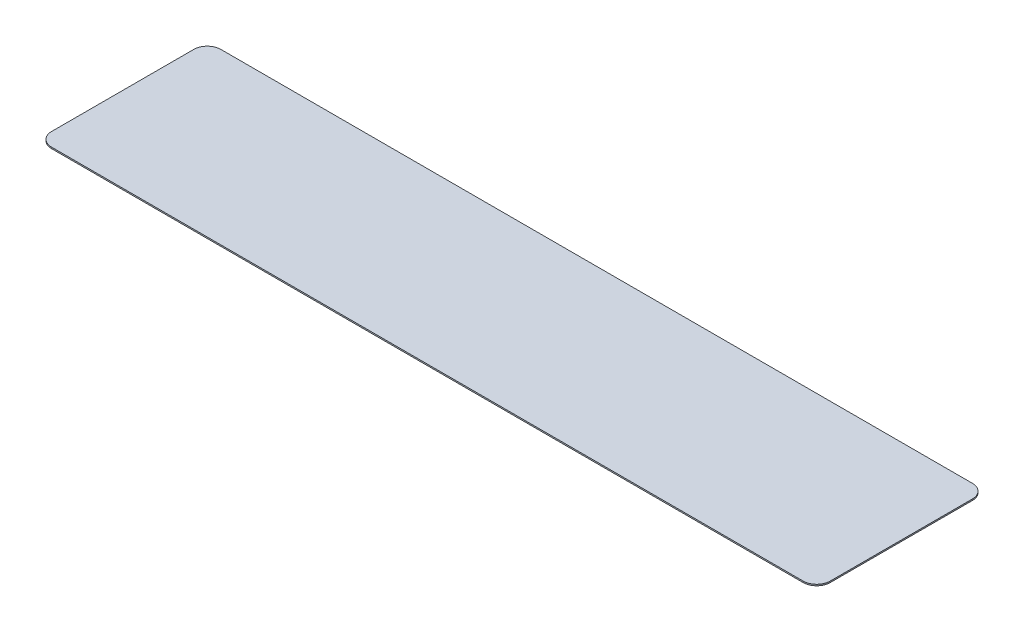
ISO-10303-21;
HEADER;
FILE_DESCRIPTION(('STEP AP214'),'2;1');
FILE_NAME('part.step','',(''),(''),'','','');
FILE_SCHEMA(('AUTOMOTIVE_DESIGN { 1 0 10303 214 1 1 1 1 }'));
ENDSEC;
DATA;
#1=APPLICATION_CONTEXT('core data for automotive mechanical design processes');
#2=APPLICATION_PROTOCOL_DEFINITION('international standard','automotive_design',2000,#1);
#3=PRODUCT_CONTEXT('',#1,'mechanical');
#4=PRODUCT('Part','Part','',(#3));
#5=PRODUCT_RELATED_PRODUCT_CATEGORY('part','',(#4));
#6=PRODUCT_DEFINITION_FORMATION('','',#4);
#7=PRODUCT_DEFINITION_CONTEXT('part definition',#1,'design');
#8=PRODUCT_DEFINITION('design','',#6,#7);
#9=PRODUCT_DEFINITION_SHAPE('','',#8);
#10=(LENGTH_UNIT() NAMED_UNIT(*) SI_UNIT(.MILLI.,.METRE.));
#11=(NAMED_UNIT(*) PLANE_ANGLE_UNIT() SI_UNIT($,.RADIAN.));
#12=(NAMED_UNIT(*) SI_UNIT($,.STERADIAN.) SOLID_ANGLE_UNIT());
#13=UNCERTAINTY_MEASURE_WITH_UNIT(LENGTH_MEASURE(1.E-05),#10,'distance_accuracy_value','');
#14=(GEOMETRIC_REPRESENTATION_CONTEXT(3) GLOBAL_UNCERTAINTY_ASSIGNED_CONTEXT((#13)) GLOBAL_UNIT_ASSIGNED_CONTEXT((#10,
#11,#12)) REPRESENTATION_CONTEXT('',''));
#15=CARTESIAN_POINT('',(0.,0.,0.));
#16=DIRECTION('',(0.,0.,1.));
#17=DIRECTION('',(1.,0.,0.));
#18=AXIS2_PLACEMENT_3D('',#15,#16,#17);
#19=CARTESIAN_POINT('',(-147.500000000002,0.399999999999713,-0.675675675675946));
#20=DIRECTION('',(0.,-0.999999999999995,0.));
#21=DIRECTION('',(0.,0.,-1.));
#22=AXIS2_PLACEMENT_3D('',#19,#20,#21);
#23=CYLINDRICAL_SURFACE('',#22,4.);
#24=CARTESIAN_POINT('',(-147.500000000001,-6.73072708679001E-13,-0.675675675675835));
#25=DIRECTION('',(0.,-0.999999999999995,0.));
#26=DIRECTION('',(0.,0.,-1.));
#27=AXIS2_PLACEMENT_3D('',#24,#25,#26);
#28=CIRCLE('',#27,4.);
#29=CARTESIAN_POINT('',(-147.5,-3.7470027081099E-13,3.3243243243245));
#30=VERTEX_POINT('',#29);
#31=CARTESIAN_POINT('',(-151.500000000003,-7.07767178198537E-13,-0.675675675675502));
#32=VERTEX_POINT('',#31);
#33=EDGE_CURVE('E143',#30,#32,#28,.T.);
#34=ORIENTED_EDGE('',*,*,#33,.F.);
#35=DIRECTION('',(0.,-0.999999999999995,0.));
#36=VECTOR('',#35,1.);
#37=CARTESIAN_POINT('',(-147.500000000002,0.399999999999665,3.32432432432422));
#38=LINE('',#37,#36);
#39=CARTESIAN_POINT('',(-147.500000000002,0.399999999999665,3.32432432432422));
#40=VERTEX_POINT('',#39);
#41=EDGE_CURVE('E11',#40,#30,#38,.T.);
#42=ORIENTED_EDGE('',*,*,#41,.F.);
#43=CARTESIAN_POINT('',(-147.500000000002,0.399999999999713,-0.675675675675946));
#44=DIRECTION('',(0.,-0.999999999999995,0.));
#45=DIRECTION('',(0.,0.,-1.));
#46=AXIS2_PLACEMENT_3D('',#43,#44,#45);
#47=CIRCLE('',#46,4.);
#48=CARTESIAN_POINT('',(-151.500000000001,0.399999999999928,-0.675675675676668));
#49=VERTEX_POINT('',#48);
#50=EDGE_CURVE('E169',#40,#49,#47,.T.);
#51=ORIENTED_EDGE('',*,*,#50,.T.);
#52=DIRECTION('',(0.,-0.999999999999995,0.));
#53=VECTOR('',#52,1.);
#54=CARTESIAN_POINT('',(-151.500000000001,0.399999999999928,-0.675675675676668));
#55=LINE('',#54,#53);
#56=EDGE_CURVE('E41',#49,#32,#55,.T.);
#57=ORIENTED_EDGE('',*,*,#56,.T.);
#58=EDGE_LOOP('',(#34,#42,#51,#57));
#59=FACE_BOUND('',#58,.T.);
#60=ADVANCED_FACE('F38',(#59),#23,.T.);
#61=CARTESIAN_POINT('',(-147.500000000002,0.399999999999665,3.32432432432422));
#62=DIRECTION('',(0.,0.,-1.));
#63=DIRECTION('',(-0.999999999999998,0.,0.));
#64=AXIS2_PLACEMENT_3D('',#61,#62,#63);
#65=PLANE('',#64);
#66=DIRECTION('',(0.999999999999998,0.,0.));
#67=VECTOR('',#66,1.);
#68=CARTESIAN_POINT('',(-147.5,-3.7470027081099E-13,3.3243243243245));
#69=LINE('',#68,#67);
#70=CARTESIAN_POINT('',(74.4999999999975,-2.77555756156289E-13,3.32432432432406));
#71=VERTEX_POINT('',#70);
#72=EDGE_CURVE('E84',#30,#71,#69,.T.);
#73=ORIENTED_EDGE('',*,*,#72,.T.);
#74=DIRECTION('',(0.,-0.999999999999995,0.));
#75=VECTOR('',#74,1.);
#76=CARTESIAN_POINT('',(74.4999999999974,0.399999999999706,3.324324324324));
#77=LINE('',#76,#75);
#78=CARTESIAN_POINT('',(74.4999999999974,0.399999999999706,3.324324324324));
#79=VERTEX_POINT('',#78);
#80=EDGE_CURVE('E48',#79,#71,#77,.T.);
#81=ORIENTED_EDGE('',*,*,#80,.F.);
#82=DIRECTION('',(0.999999999999998,0.,0.));
#83=VECTOR('',#82,1.);
#84=CARTESIAN_POINT('',(-147.500000000002,0.399999999999665,3.32432432432422));
#85=LINE('',#84,#83);
#86=EDGE_CURVE('E115',#40,#79,#85,.T.);
#87=ORIENTED_EDGE('',*,*,#86,.F.);
#88=ORIENTED_EDGE('',*,*,#41,.T.);
#89=EDGE_LOOP('',(#73,#81,#87,#88));
#90=FACE_BOUND('',#89,.T.);
#91=ADVANCED_FACE('F233',(#90),#65,.F.);
#92=CARTESIAN_POINT('',(74.4999999999994,0.399999999999762,-0.675675675675669));
#93=DIRECTION('',(0.,-0.999999999999995,0.));
#94=DIRECTION('',(0.,0.,-1.));
#95=AXIS2_PLACEMENT_3D('',#92,#93,#94);
#96=CYLINDRICAL_SURFACE('',#95,4.);
#97=CARTESIAN_POINT('',(74.5000000000003,-9.15933995315754E-13,-0.675675675675558));
#98=DIRECTION('',(0.,0.999999999999995,0.));
#99=DIRECTION('',(0.,0.,1.));
#100=AXIS2_PLACEMENT_3D('',#97,#98,#99);
#101=CIRCLE('',#100,4.);
#102=CARTESIAN_POINT('',(78.4999999999988,-6.52256026967279E-13,-0.675675675676446));
#103=VERTEX_POINT('',#102);
#104=EDGE_CURVE('E123',#71,#103,#101,.T.);
#105=ORIENTED_EDGE('',*,*,#104,.T.);
#106=DIRECTION('',(0.,-0.999999999999995,0.));
#107=VECTOR('',#106,1.);
#108=CARTESIAN_POINT('',(78.5000000000009,0.39999999999997,-0.675675675676501));
#109=LINE('',#108,#107);
#110=CARTESIAN_POINT('',(78.5000000000009,0.39999999999997,-0.675675675676501));
#111=VERTEX_POINT('',#110);
#112=EDGE_CURVE('E120',#111,#103,#109,.T.);
#113=ORIENTED_EDGE('',*,*,#112,.F.);
#114=CARTESIAN_POINT('',(74.4999999999994,0.399999999999762,-0.675675675675669));
#115=DIRECTION('',(0.,0.999999999999995,0.));
#116=DIRECTION('',(0.,0.,1.));
#117=AXIS2_PLACEMENT_3D('',#114,#115,#116);
#118=CIRCLE('',#117,4.);
#119=EDGE_CURVE('E108',#79,#111,#118,.T.);
#120=ORIENTED_EDGE('',*,*,#119,.F.);
#121=ORIENTED_EDGE('',*,*,#80,.T.);
#122=EDGE_LOOP('',(#105,#113,#120,#121));
#123=FACE_BOUND('',#122,.T.);
#124=ADVANCED_FACE('F121',(#123),#96,.T.);
#125=CARTESIAN_POINT('',(78.5000000000009,0.39999999999997,-0.675675675676501));
#126=DIRECTION('',(-0.999999999999998,0.,0.));
#127=DIRECTION('',(0.,0.,1.));
#128=AXIS2_PLACEMENT_3D('',#125,#126,#127);
#129=PLANE('',#128);
#130=DIRECTION('',(0.,0.,-1.));
#131=VECTOR('',#130,1.);
#132=CARTESIAN_POINT('',(78.4999999999988,-6.52256026967279E-13,-0.675675675676446));
#133=LINE('',#132,#131);
#134=CARTESIAN_POINT('',(78.4999999999988,0.,-42.6756756756765));
#135=VERTEX_POINT('',#134);
#136=EDGE_CURVE('E163',#103,#135,#133,.T.);
#137=ORIENTED_EDGE('',*,*,#136,.T.);
#138=DIRECTION('',(0.,-0.999999999999995,0.));
#139=VECTOR('',#138,1.);
#140=CARTESIAN_POINT('',(78.4999999999998,0.399999999999234,-42.6756756756764));
#141=LINE('',#140,#139);
#142=CARTESIAN_POINT('',(78.4999999999998,0.399999999999234,-42.6756756756764));
#143=VERTEX_POINT('',#142);
#144=EDGE_CURVE('E127',#143,#135,#141,.T.);
#145=ORIENTED_EDGE('',*,*,#144,.F.);
#146=DIRECTION('',(0.,0.,-1.));
#147=VECTOR('',#146,1.);
#148=CARTESIAN_POINT('',(78.5000000000009,0.39999999999997,-0.675675675676501));
#149=LINE('',#148,#147);
#150=EDGE_CURVE('E113',#111,#143,#149,.T.);
#151=ORIENTED_EDGE('',*,*,#150,.F.);
#152=ORIENTED_EDGE('',*,*,#112,.T.);
#153=EDGE_LOOP('',(#137,#145,#151,#152));
#154=FACE_BOUND('',#153,.T.);
#155=ADVANCED_FACE('F129',(#154),#129,.F.);
#156=CARTESIAN_POINT('',(74.5000000000011,0.399999999999207,-42.6756756756757));
#157=DIRECTION('',(0.,-0.999999999999995,0.));
#158=DIRECTION('',(0.,0.,-1.));
#159=AXIS2_PLACEMENT_3D('',#156,#157,#158);
#160=CYLINDRICAL_SURFACE('',#159,4.);
#161=CARTESIAN_POINT('',(74.4999999999978,0.,-42.6756756756741));
#162=DIRECTION('',(0.,0.999999999999995,0.));
#163=DIRECTION('',(0.,0.,1.));
#164=AXIS2_PLACEMENT_3D('',#161,#162,#163);
#165=CIRCLE('',#164,4.);
#166=CARTESIAN_POINT('',(74.4999999999991,-2.08166817117217E-13,-46.675675675676));
#167=VERTEX_POINT('',#166);
#168=EDGE_CURVE('E159',#135,#167,#165,.T.);
#169=ORIENTED_EDGE('',*,*,#168,.T.);
#170=DIRECTION('',(0.,-0.999999999999995,0.));
#171=VECTOR('',#170,1.);
#172=CARTESIAN_POINT('',(74.4999999999996,0.400000000000109,-46.6756756756748));
#173=LINE('',#172,#171);
#174=CARTESIAN_POINT('',(74.4999999999996,0.400000000000109,-46.6756756756748));
#175=VERTEX_POINT('',#174);
#176=EDGE_CURVE('E175',#175,#167,#173,.T.);
#177=ORIENTED_EDGE('',*,*,#176,.F.);
#178=CARTESIAN_POINT('',(74.5000000000011,0.399999999999207,-42.6756756756757));
#179=DIRECTION('',(0.,0.999999999999995,0.));
#180=DIRECTION('',(0.,0.,1.));
#181=AXIS2_PLACEMENT_3D('',#178,#179,#180);
#182=CIRCLE('',#181,4.);
#183=EDGE_CURVE('E133',#143,#175,#182,.T.);
#184=ORIENTED_EDGE('',*,*,#183,.F.);
#185=ORIENTED_EDGE('',*,*,#144,.T.);
#186=EDGE_LOOP('',(#169,#177,#184,#185));
#187=FACE_BOUND('',#186,.T.);
#188=ADVANCED_FACE('F191',(#187),#160,.T.);
#189=CARTESIAN_POINT('',(-147.500000000001,0.400000000000178,-46.6756756756764));
#190=DIRECTION('',(0.,0.,-1.));
#191=DIRECTION('',(-0.999999999999998,0.,0.));
#192=AXIS2_PLACEMENT_3D('',#189,#190,#191);
#193=PLANE('',#192);
#194=DIRECTION('',(0.999999999999998,0.,0.));
#195=VECTOR('',#194,1.);
#196=CARTESIAN_POINT('',(-147.499999999999,0.,-46.6756756756748));
#197=LINE('',#196,#195);
#198=CARTESIAN_POINT('',(-147.499999999999,0.,-46.6756756756748));
#199=VERTEX_POINT('',#198);
#200=EDGE_CURVE('E155',#199,#167,#197,.T.);
#201=ORIENTED_EDGE('',*,*,#200,.F.);
#202=DIRECTION('',(0.,-0.999999999999995,0.));
#203=VECTOR('',#202,1.);
#204=CARTESIAN_POINT('',(-147.500000000001,0.400000000000178,-46.6756756756764));
#205=LINE('',#204,#203);
#206=CARTESIAN_POINT('',(-147.500000000001,0.400000000000178,-46.6756756756764));
#207=VERTEX_POINT('',#206);
#208=EDGE_CURVE('E178',#207,#199,#205,.T.);
#209=ORIENTED_EDGE('',*,*,#208,.F.);
#210=DIRECTION('',(0.999999999999998,0.,0.));
#211=VECTOR('',#210,1.);
#212=CARTESIAN_POINT('',(-147.500000000001,0.400000000000178,-46.6756756756764));
#213=LINE('',#212,#211);
#214=EDGE_CURVE('E137',#207,#175,#213,.T.);
#215=ORIENTED_EDGE('',*,*,#214,.T.);
#216=ORIENTED_EDGE('',*,*,#176,.T.);
#217=EDGE_LOOP('',(#201,#209,#215,#216));
#218=FACE_BOUND('',#217,.T.);
#219=ADVANCED_FACE('F223',(#218),#193,.T.);
#220=CARTESIAN_POINT('',(-147.500000000001,0.399999999999311,-42.6756756756767));
#221=DIRECTION('',(0.,-0.999999999999995,0.));
#222=DIRECTION('',(0.,0.,-1.));
#223=AXIS2_PLACEMENT_3D('',#220,#221,#222);
#224=CYLINDRICAL_SURFACE('',#223,4.00000000000001);
#225=CARTESIAN_POINT('',(-147.500000000001,0.,-42.6756756756757));
#226=DIRECTION('',(0.,-0.999999999999995,0.));
#227=DIRECTION('',(0.,0.,-1.));
#228=AXIS2_PLACEMENT_3D('',#225,#226,#227);
#229=CIRCLE('',#228,4.00000000000001);
#230=CARTESIAN_POINT('',(-151.500000000002,0.,-42.6756756756766));
#231=VERTEX_POINT('',#230);
#232=EDGE_CURVE('E151',#231,#199,#229,.T.);
#233=ORIENTED_EDGE('',*,*,#232,.F.);
#234=DIRECTION('',(0.,-0.999999999999995,0.));
#235=VECTOR('',#234,1.);
#236=CARTESIAN_POINT('',(-151.500000000002,0.399999999999345,-42.6756756756771));
#237=LINE('',#236,#235);
#238=CARTESIAN_POINT('',(-151.500000000002,0.399999999999345,-42.6756756756771));
#239=VERTEX_POINT('',#238);
#240=EDGE_CURVE('E180',#239,#231,#237,.T.);
#241=ORIENTED_EDGE('',*,*,#240,.F.);
#242=CARTESIAN_POINT('',(-147.500000000001,0.399999999999311,-42.6756756756767));
#243=DIRECTION('',(0.,-0.999999999999995,0.));
#244=DIRECTION('',(0.,0.,-1.));
#245=AXIS2_PLACEMENT_3D('',#242,#243,#244);
#246=CIRCLE('',#245,4.00000000000001);
#247=EDGE_CURVE('E197',#239,#207,#246,.T.);
#248=ORIENTED_EDGE('',*,*,#247,.T.);
#249=ORIENTED_EDGE('',*,*,#208,.T.);
#250=EDGE_LOOP('',(#233,#241,#248,#249));
#251=FACE_BOUND('',#250,.T.);
#252=ADVANCED_FACE('F201',(#251),#224,.T.);
#253=CARTESIAN_POINT('',(-151.500000000001,0.399999999999928,-0.675675675676668));
#254=DIRECTION('',(-0.999999999999998,0.,0.));
#255=DIRECTION('',(0.,0.,1.));
#256=AXIS2_PLACEMENT_3D('',#253,#254,#255);
#257=PLANE('',#256);
#258=DIRECTION('',(0.,0.,-1.));
#259=VECTOR('',#258,1.);
#260=CARTESIAN_POINT('',(-151.500000000003,-7.07767178198537E-13,-0.675675675675502));
#261=LINE('',#260,#259);
#262=EDGE_CURVE('E147',#32,#231,#261,.T.);
#263=ORIENTED_EDGE('',*,*,#262,.F.);
#264=ORIENTED_EDGE('',*,*,#56,.F.);
#265=DIRECTION('',(0.,0.,-1.));
#266=VECTOR('',#265,1.);
#267=CARTESIAN_POINT('',(-151.500000000001,0.399999999999928,-0.675675675676668));
#268=LINE('',#267,#266);
#269=EDGE_CURVE('E204',#49,#239,#268,.T.);
#270=ORIENTED_EDGE('',*,*,#269,.T.);
#271=ORIENTED_EDGE('',*,*,#240,.T.);
#272=EDGE_LOOP('',(#263,#264,#270,#271));
#273=FACE_BOUND('',#272,.T.);
#274=ADVANCED_FACE('F186',(#273),#257,.T.);
#275=CARTESIAN_POINT('',(-147.500000000002,0.399999999999713,-0.675675675675946));
#276=DIRECTION('',(0.,-0.999999999999995,0.));
#277=DIRECTION('',(0.,0.,-1.));
#278=AXIS2_PLACEMENT_3D('',#275,#276,#277);
#279=PLANE('',#278);
#280=ORIENTED_EDGE('',*,*,#50,.F.);
#281=ORIENTED_EDGE('',*,*,#86,.T.);
#282=ORIENTED_EDGE('',*,*,#119,.T.);
#283=ORIENTED_EDGE('',*,*,#150,.T.);
#284=ORIENTED_EDGE('',*,*,#183,.T.);
#285=ORIENTED_EDGE('',*,*,#214,.F.);
#286=ORIENTED_EDGE('',*,*,#247,.F.);
#287=ORIENTED_EDGE('',*,*,#269,.F.);
#288=EDGE_LOOP('',(#280,#281,#282,#283,#284,#285,#286,#287));
#289=FACE_BOUND('',#288,.T.);
#290=ADVANCED_FACE('F111',(#289),#279,.F.);
#291=CARTESIAN_POINT('',(-147.500000000001,-6.73072708679001E-13,-0.675675675675835));
#292=DIRECTION('',(0.,-0.999999999999995,0.));
#293=DIRECTION('',(0.,0.,-1.));
#294=AXIS2_PLACEMENT_3D('',#291,#292,#293);
#295=PLANE('',#294);
#296=ORIENTED_EDGE('',*,*,#33,.T.);
#297=ORIENTED_EDGE('',*,*,#262,.T.);
#298=ORIENTED_EDGE('',*,*,#232,.T.);
#299=ORIENTED_EDGE('',*,*,#200,.T.);
#300=ORIENTED_EDGE('',*,*,#168,.F.);
#301=ORIENTED_EDGE('',*,*,#136,.F.);
#302=ORIENTED_EDGE('',*,*,#104,.F.);
#303=ORIENTED_EDGE('',*,*,#72,.F.);
#304=EDGE_LOOP('',(#296,#297,#298,#299,#300,#301,#302,#303));
#305=FACE_BOUND('',#304,.T.);
#306=ADVANCED_FACE('F188',(#305),#295,.T.);
#307=CLOSED_SHELL('',(#60,#91,#124,#155,#188,#219,#252,#274,#290,#306));
#308=MANIFOLD_SOLID_BREP('B2',#307);
#309=ADVANCED_BREP_SHAPE_REPRESENTATION('',(#18,#308),#14);
#310=SHAPE_DEFINITION_REPRESENTATION(#9,#309);
ENDSEC;
END-ISO-10303-21;
